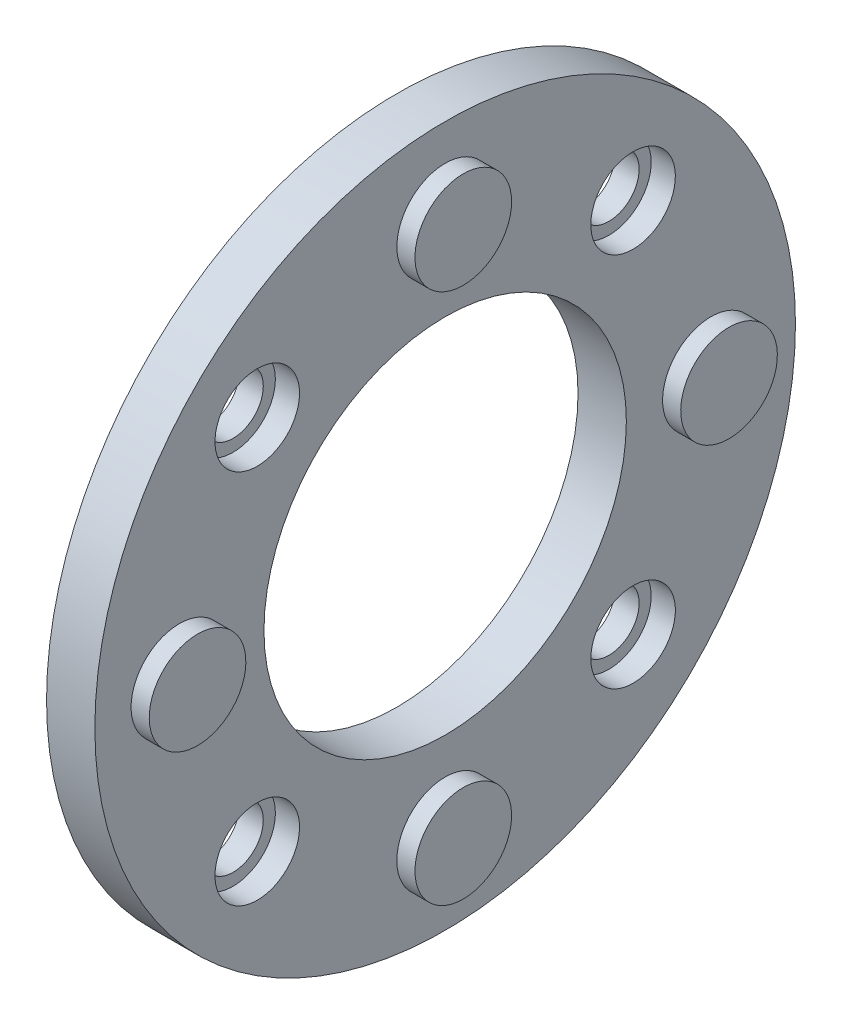
ISO-10303-21;
HEADER;
FILE_DESCRIPTION(('STEP AP214'),'2;1');
FILE_NAME('part.step','',(''),(''),'','','');
FILE_SCHEMA(('AUTOMOTIVE_DESIGN { 1 0 10303 214 1 1 1 1 }'));
ENDSEC;
DATA;
#1=APPLICATION_CONTEXT('core data for automotive mechanical design processes');
#2=APPLICATION_PROTOCOL_DEFINITION('international standard','automotive_design',2000,#1);
#3=PRODUCT_CONTEXT('',#1,'mechanical');
#4=PRODUCT('Part','Part','',(#3));
#5=PRODUCT_RELATED_PRODUCT_CATEGORY('part','',(#4));
#6=PRODUCT_DEFINITION_FORMATION('','',#4);
#7=PRODUCT_DEFINITION_CONTEXT('part definition',#1,'design');
#8=PRODUCT_DEFINITION('design','',#6,#7);
#9=PRODUCT_DEFINITION_SHAPE('','',#8);
#10=(LENGTH_UNIT() NAMED_UNIT(*) SI_UNIT(.MILLI.,.METRE.));
#11=(NAMED_UNIT(*) PLANE_ANGLE_UNIT() SI_UNIT($,.RADIAN.));
#12=(NAMED_UNIT(*) SI_UNIT($,.STERADIAN.) SOLID_ANGLE_UNIT());
#13=UNCERTAINTY_MEASURE_WITH_UNIT(LENGTH_MEASURE(1.E-05),#10,'distance_accuracy_value','');
#14=(GEOMETRIC_REPRESENTATION_CONTEXT(3) GLOBAL_UNCERTAINTY_ASSIGNED_CONTEXT((#13)) GLOBAL_UNIT_ASSIGNED_CONTEXT((#10,
#11,#12)) REPRESENTATION_CONTEXT('',''));
#15=CARTESIAN_POINT('',(0.,0.,0.));
#16=DIRECTION('',(0.,0.,1.));
#17=DIRECTION('',(1.,0.,0.));
#18=AXIS2_PLACEMENT_3D('',#15,#16,#17);
#19=CARTESIAN_POINT('',(-1.,15.556349186104,15.5563491861041));
#20=DIRECTION('',(1.,0.,0.));
#21=DIRECTION('',(0.,0.,-1.));
#22=AXIS2_PLACEMENT_3D('',#19,#20,#21);
#23=CYLINDRICAL_SURFACE('',#22,2.5);
#24=CARTESIAN_POINT('',(0.,15.556349186104,15.5563491861041));
#25=DIRECTION('',(1.,0.,0.));
#26=DIRECTION('',(0.,0.,-1.));
#27=AXIS2_PLACEMENT_3D('',#24,#25,#26);
#28=CIRCLE('',#27,2.5);
#29=CARTESIAN_POINT('',(0.,15.556349186104,13.0563491861041));
#30=VERTEX_POINT('',#29);
#31=EDGE_CURVE('E55',#30,#30,#28,.T.);
#32=ORIENTED_EDGE('',*,*,#31,.F.);
#33=EDGE_LOOP('',(#32));
#34=FACE_BOUND('',#33,.T.);
#35=CARTESIAN_POINT('',(2.,15.556349186104,15.5563491861041));
#36=DIRECTION('',(1.,0.,0.));
#37=DIRECTION('',(0.,0.,-1.));
#38=AXIS2_PLACEMENT_3D('',#35,#36,#37);
#39=CIRCLE('',#38,2.5);
#40=CARTESIAN_POINT('',(2.,15.556349186104,13.0563491861041));
#41=VERTEX_POINT('',#40);
#42=EDGE_CURVE('E43',#41,#41,#39,.F.);
#43=ORIENTED_EDGE('',*,*,#42,.F.);
#44=EDGE_LOOP('',(#43));
#45=FACE_BOUND('',#44,.T.);
#46=ADVANCED_FACE('F39',(#34,#45),#23,.F.);
#47=CARTESIAN_POINT('',(4.,0.,0.));
#48=DIRECTION('',(-1.,0.,0.));
#49=DIRECTION('',(0.,0.,1.));
#50=AXIS2_PLACEMENT_3D('',#47,#48,#49);
#51=CYLINDRICAL_SURFACE('',#50,29.);
#52=CARTESIAN_POINT('',(4.,0.,0.));
#53=DIRECTION('',(1.,0.,0.));
#54=DIRECTION('',(0.,0.,-1.));
#55=AXIS2_PLACEMENT_3D('',#52,#53,#54);
#56=CIRCLE('',#55,29.);
#57=CARTESIAN_POINT('',(4.,0.,-29.));
#58=VERTEX_POINT('',#57);
#59=EDGE_CURVE('E136',#58,#58,#56,.T.);
#60=ORIENTED_EDGE('',*,*,#59,.F.);
#61=EDGE_LOOP('',(#60));
#62=FACE_BOUND('',#61,.T.);
#63=CARTESIAN_POINT('',(0.,0.,0.));
#64=DIRECTION('',(1.,0.,0.));
#65=DIRECTION('',(0.,0.,-1.));
#66=AXIS2_PLACEMENT_3D('',#63,#64,#65);
#67=CIRCLE('',#66,29.);
#68=CARTESIAN_POINT('',(0.,0.,-29.));
#69=VERTEX_POINT('',#68);
#70=EDGE_CURVE('E143',#69,#69,#67,.T.);
#71=ORIENTED_EDGE('',*,*,#70,.T.);
#72=EDGE_LOOP('',(#71));
#73=FACE_BOUND('',#72,.T.);
#74=ADVANCED_FACE('F41',(#62,#73),#51,.T.);
#75=CARTESIAN_POINT('',(4.,0.,0.));
#76=DIRECTION('',(1.,0.,0.));
#77=DIRECTION('',(0.,0.,-1.));
#78=AXIS2_PLACEMENT_3D('',#75,#76,#77);
#79=PLANE('',#78);
#80=CARTESIAN_POINT('',(4.,-15.5563491861042,15.5563491861039));
#81=DIRECTION('',(1.,0.,0.));
#82=DIRECTION('',(0.,1.,0.));
#83=AXIS2_PLACEMENT_3D('',#80,#81,#82);
#84=CIRCLE('',#83,3.5);
#85=CARTESIAN_POINT('',(4.,-12.0563491861042,15.5563491861039));
#86=VERTEX_POINT('',#85);
#87=EDGE_CURVE('E707',#86,#86,#84,.T.);
#88=ORIENTED_EDGE('',*,*,#87,.F.);
#89=EDGE_LOOP('',(#88));
#90=FACE_BOUND('',#89,.T.);
#91=CARTESIAN_POINT('',(4.,-15.556349186104,-15.5563491861041));
#92=DIRECTION('',(1.,0.,0.));
#93=DIRECTION('',(0.,0.,1.));
#94=AXIS2_PLACEMENT_3D('',#91,#92,#93);
#95=CIRCLE('',#94,3.5);
#96=CARTESIAN_POINT('',(4.,-15.556349186104,-12.0563491861041));
#97=VERTEX_POINT('',#96);
#98=EDGE_CURVE('E665',#97,#97,#95,.T.);
#99=ORIENTED_EDGE('',*,*,#98,.F.);
#100=EDGE_LOOP('',(#99));
#101=FACE_BOUND('',#100,.T.);
#102=CARTESIAN_POINT('',(4.,15.5563491861043,-15.5563491861038));
#103=DIRECTION('',(1.,0.,0.));
#104=DIRECTION('',(0.,-1.,0.));
#105=AXIS2_PLACEMENT_3D('',#102,#103,#104);
#106=CIRCLE('',#105,3.5);
#107=CARTESIAN_POINT('',(4.,12.0563491861043,-15.5563491861038));
#108=VERTEX_POINT('',#107);
#109=EDGE_CURVE('E662',#108,#108,#106,.T.);
#110=ORIENTED_EDGE('',*,*,#109,.F.);
#111=EDGE_LOOP('',(#110));
#112=FACE_BOUND('',#111,.T.);
#113=CARTESIAN_POINT('',(4.,15.556349186104,15.5563491861041));
#114=DIRECTION('',(1.,0.,0.));
#115=DIRECTION('',(0.,0.,-1.));
#116=AXIS2_PLACEMENT_3D('',#113,#114,#115);
#117=CIRCLE('',#116,3.5);
#118=CARTESIAN_POINT('',(4.,15.556349186104,12.0563491861041));
#119=VERTEX_POINT('',#118);
#120=EDGE_CURVE('E68',#119,#119,#117,.T.);
#121=ORIENTED_EDGE('',*,*,#120,.F.);
#122=EDGE_LOOP('',(#121));
#123=FACE_BOUND('',#122,.T.);
#124=CARTESIAN_POINT('',(4.,2.30437768363647E-13,-22.));
#125=DIRECTION('',(1.,0.,0.));
#126=DIRECTION('',(0.,0.,-1.));
#127=AXIS2_PLACEMENT_3D('',#124,#125,#126);
#128=CIRCLE('',#127,4.);
#129=CARTESIAN_POINT('',(4.,2.30437768363647E-13,-26.));
#130=VERTEX_POINT('',#129);
#131=EDGE_CURVE('E10',#130,#130,#128,.T.);
#132=ORIENTED_EDGE('',*,*,#131,.F.);
#133=EDGE_LOOP('',(#132));
#134=FACE_BOUND('',#133,.T.);
#135=CARTESIAN_POINT('',(4.,-22.,0.));
#136=DIRECTION('',(1.,0.,0.));
#137=DIRECTION('',(0.,0.,-1.));
#138=AXIS2_PLACEMENT_3D('',#135,#136,#137);
#139=CIRCLE('',#138,4.);
#140=CARTESIAN_POINT('',(4.,-22.,-4.));
#141=VERTEX_POINT('',#140);
#142=EDGE_CURVE('E47',#141,#141,#139,.T.);
#143=ORIENTED_EDGE('',*,*,#142,.F.);
#144=EDGE_LOOP('',(#143));
#145=FACE_BOUND('',#144,.T.);
#146=CARTESIAN_POINT('',(4.,0.,22.));
#147=DIRECTION('',(1.,0.,0.));
#148=DIRECTION('',(0.,0.,-1.));
#149=AXIS2_PLACEMENT_3D('',#146,#147,#148);
#150=CIRCLE('',#149,4.);
#151=CARTESIAN_POINT('',(4.,0.,18.));
#152=VERTEX_POINT('',#151);
#153=EDGE_CURVE('E52',#152,#152,#150,.T.);
#154=ORIENTED_EDGE('',*,*,#153,.F.);
#155=EDGE_LOOP('',(#154));
#156=FACE_BOUND('',#155,.T.);
#157=CARTESIAN_POINT('',(4.,22.,0.));
#158=DIRECTION('',(1.,0.,0.));
#159=DIRECTION('',(0.,0.,-1.));
#160=AXIS2_PLACEMENT_3D('',#157,#158,#159);
#161=CIRCLE('',#160,4.);
#162=CARTESIAN_POINT('',(4.,22.,-4.));
#163=VERTEX_POINT('',#162);
#164=EDGE_CURVE('E133',#163,#163,#161,.T.);
#165=ORIENTED_EDGE('',*,*,#164,.F.);
#166=EDGE_LOOP('',(#165));
#167=FACE_BOUND('',#166,.T.);
#168=CARTESIAN_POINT('',(4.,0.,0.));
#169=DIRECTION('',(1.,0.,0.));
#170=DIRECTION('',(0.,0.,-1.));
#171=AXIS2_PLACEMENT_3D('',#168,#169,#170);
#172=CIRCLE('',#171,15.);
#173=CARTESIAN_POINT('',(4.,0.,-15.));
#174=VERTEX_POINT('',#173);
#175=EDGE_CURVE('E140',#174,#174,#172,.T.);
#176=ORIENTED_EDGE('',*,*,#175,.F.);
#177=EDGE_LOOP('',(#176));
#178=FACE_BOUND('',#177,.T.);
#179=ORIENTED_EDGE('',*,*,#59,.T.);
#180=EDGE_LOOP('',(#179));
#181=FACE_BOUND('',#180,.T.);
#182=ADVANCED_FACE('F155',(#90,#101,#112,#123,#134,#145,#156,#167,#178,#181),#79,.T.);
#183=CARTESIAN_POINT('',(0.,0.,0.));
#184=DIRECTION('',(1.,0.,0.));
#185=DIRECTION('',(0.,0.,-1.));
#186=AXIS2_PLACEMENT_3D('',#183,#184,#185);
#187=PLANE('',#186);
#188=CARTESIAN_POINT('',(0.,-15.5563491861042,15.5563491861039));
#189=DIRECTION('',(1.,0.,0.));
#190=DIRECTION('',(0.,1.,0.));
#191=AXIS2_PLACEMENT_3D('',#188,#189,#190);
#192=CIRCLE('',#191,2.5);
#193=CARTESIAN_POINT('',(0.,-13.0563491861042,15.5563491861039));
#194=VERTEX_POINT('',#193);
#195=EDGE_CURVE('E73',#194,#194,#192,.T.);
#196=ORIENTED_EDGE('',*,*,#195,.T.);
#197=EDGE_LOOP('',(#196));
#198=FACE_BOUND('',#197,.T.);
#199=CARTESIAN_POINT('',(0.,-15.556349186104,-15.5563491861041));
#200=DIRECTION('',(1.,0.,0.));
#201=DIRECTION('',(0.,0.,1.));
#202=AXIS2_PLACEMENT_3D('',#199,#200,#201);
#203=CIRCLE('',#202,2.5);
#204=CARTESIAN_POINT('',(0.,-15.556349186104,-13.0563491861041));
#205=VERTEX_POINT('',#204);
#206=EDGE_CURVE('E681',#205,#205,#203,.T.);
#207=ORIENTED_EDGE('',*,*,#206,.T.);
#208=EDGE_LOOP('',(#207));
#209=FACE_BOUND('',#208,.T.);
#210=CARTESIAN_POINT('',(0.,15.5563491861043,-15.5563491861038));
#211=DIRECTION('',(1.,0.,0.));
#212=DIRECTION('',(0.,-1.,0.));
#213=AXIS2_PLACEMENT_3D('',#210,#211,#212);
#214=CIRCLE('',#213,2.5);
#215=CARTESIAN_POINT('',(0.,13.0563491861043,-15.5563491861038));
#216=VERTEX_POINT('',#215);
#217=EDGE_CURVE('E76',#216,#216,#214,.T.);
#218=ORIENTED_EDGE('',*,*,#217,.T.);
#219=EDGE_LOOP('',(#218));
#220=FACE_BOUND('',#219,.T.);
#221=ORIENTED_EDGE('',*,*,#31,.T.);
#222=EDGE_LOOP('',(#221));
#223=FACE_BOUND('',#222,.T.);
#224=CARTESIAN_POINT('',(0.,2.30437768363647E-13,-22.));
#225=DIRECTION('',(1.,0.,0.));
#226=DIRECTION('',(0.,-1.,0.));
#227=AXIS2_PLACEMENT_3D('',#224,#225,#226);
#228=CIRCLE('',#227,4.);
#229=CARTESIAN_POINT('',(0.,-3.99999999999977,-22.));
#230=VERTEX_POINT('',#229);
#231=EDGE_CURVE('E97',#230,#230,#228,.T.);
#232=ORIENTED_EDGE('',*,*,#231,.T.);
#233=EDGE_LOOP('',(#232));
#234=FACE_BOUND('',#233,.T.);
#235=CARTESIAN_POINT('',(0.,-22.,0.));
#236=DIRECTION('',(1.,0.,0.));
#237=DIRECTION('',(0.,0.,1.));
#238=AXIS2_PLACEMENT_3D('',#235,#236,#237);
#239=CIRCLE('',#238,4.);
#240=CARTESIAN_POINT('',(0.,-22.,4.));
#241=VERTEX_POINT('',#240);
#242=EDGE_CURVE('E105',#241,#241,#239,.T.);
#243=ORIENTED_EDGE('',*,*,#242,.T.);
#244=EDGE_LOOP('',(#243));
#245=FACE_BOUND('',#244,.T.);
#246=CARTESIAN_POINT('',(0.,0.,22.));
#247=DIRECTION('',(1.,0.,0.));
#248=DIRECTION('',(0.,1.,0.));
#249=AXIS2_PLACEMENT_3D('',#246,#247,#248);
#250=CIRCLE('',#249,4.);
#251=CARTESIAN_POINT('',(0.,3.99999999999992,22.));
#252=VERTEX_POINT('',#251);
#253=EDGE_CURVE('E111',#252,#252,#250,.T.);
#254=ORIENTED_EDGE('',*,*,#253,.T.);
#255=EDGE_LOOP('',(#254));
#256=FACE_BOUND('',#255,.T.);
#257=CARTESIAN_POINT('',(0.,22.,0.));
#258=DIRECTION('',(1.,0.,0.));
#259=DIRECTION('',(0.,0.,-1.));
#260=AXIS2_PLACEMENT_3D('',#257,#258,#259);
#261=CIRCLE('',#260,4.);
#262=CARTESIAN_POINT('',(0.,22.,-4.));
#263=VERTEX_POINT('',#262);
#264=EDGE_CURVE('E132',#263,#263,#261,.T.);
#265=ORIENTED_EDGE('',*,*,#264,.T.);
#266=EDGE_LOOP('',(#265));
#267=FACE_BOUND('',#266,.T.);
#268=CARTESIAN_POINT('',(0.,0.,0.));
#269=DIRECTION('',(1.,0.,0.));
#270=DIRECTION('',(0.,0.,-1.));
#271=AXIS2_PLACEMENT_3D('',#268,#269,#270);
#272=CIRCLE('',#271,15.);
#273=CARTESIAN_POINT('',(0.,0.,-15.));
#274=VERTEX_POINT('',#273);
#275=EDGE_CURVE('E137',#274,#274,#272,.T.);
#276=ORIENTED_EDGE('',*,*,#275,.T.);
#277=EDGE_LOOP('',(#276));
#278=FACE_BOUND('',#277,.T.);
#279=ORIENTED_EDGE('',*,*,#70,.F.);
#280=EDGE_LOOP('',(#279));
#281=FACE_BOUND('',#280,.T.);
#282=ADVANCED_FACE('F158',(#198,#209,#220,#223,#234,#245,#256,#267,#278,#281),#187,.F.);
#283=CARTESIAN_POINT('',(0.,0.,0.));
#284=DIRECTION('',(1.,0.,0.));
#285=DIRECTION('',(0.,0.,-1.));
#286=AXIS2_PLACEMENT_3D('',#283,#284,#285);
#287=CYLINDRICAL_SURFACE('',#286,15.);
#288=ORIENTED_EDGE('',*,*,#175,.T.);
#289=EDGE_LOOP('',(#288));
#290=FACE_BOUND('',#289,.T.);
#291=ORIENTED_EDGE('',*,*,#275,.F.);
#292=EDGE_LOOP('',(#291));
#293=FACE_BOUND('',#292,.T.);
#294=ADVANCED_FACE('F172',(#290,#293),#287,.F.);
#295=CARTESIAN_POINT('',(-1.,0.,0.));
#296=DIRECTION('',(1.,0.,0.));
#297=DIRECTION('',(0.,0.,-1.));
#298=AXIS2_PLACEMENT_3D('',#295,#296,#297);
#299=PLANE('',#298);
#300=CARTESIAN_POINT('',(-1.,22.,0.));
#301=DIRECTION('',(-1.,0.,0.));
#302=DIRECTION('',(0.,0.,1.));
#303=AXIS2_PLACEMENT_3D('',#300,#301,#302);
#304=CIRCLE('',#303,2.5);
#305=CARTESIAN_POINT('',(-1.,22.,2.5));
#306=VERTEX_POINT('',#305);
#307=EDGE_CURVE('E86',#306,#306,#304,.T.);
#308=ORIENTED_EDGE('',*,*,#307,.F.);
#309=EDGE_LOOP('',(#308));
#310=FACE_BOUND('',#309,.T.);
#311=CARTESIAN_POINT('',(-1.,22.,0.));
#312=DIRECTION('',(1.,0.,0.));
#313=DIRECTION('',(0.,0.,-1.));
#314=AXIS2_PLACEMENT_3D('',#311,#312,#313);
#315=CIRCLE('',#314,4.);
#316=CARTESIAN_POINT('',(-1.,22.,-4.));
#317=VERTEX_POINT('',#316);
#318=EDGE_CURVE('E129',#317,#317,#315,.T.);
#319=ORIENTED_EDGE('',*,*,#318,.F.);
#320=EDGE_LOOP('',(#319));
#321=FACE_BOUND('',#320,.T.);
#322=ADVANCED_FACE('F177',(#310,#321),#299,.F.);
#323=CARTESIAN_POINT('',(-1.,22.,0.));
#324=DIRECTION('',(1.,0.,0.));
#325=DIRECTION('',(0.,0.,-1.));
#326=AXIS2_PLACEMENT_3D('',#323,#324,#325);
#327=CYLINDRICAL_SURFACE('',#326,4.);
#328=ORIENTED_EDGE('',*,*,#318,.T.);
#329=EDGE_LOOP('',(#328));
#330=FACE_BOUND('',#329,.T.);
#331=ORIENTED_EDGE('',*,*,#264,.F.);
#332=EDGE_LOOP('',(#331));
#333=FACE_BOUND('',#332,.T.);
#334=ADVANCED_FACE('F277',(#330,#333),#327,.T.);
#335=ORIENTED_EDGE('',*,*,#164,.T.);
#336=EDGE_LOOP('',(#335));
#337=FACE_BOUND('',#336,.T.);
#338=CARTESIAN_POINT('',(5.5,22.,0.));
#339=DIRECTION('',(1.,0.,0.));
#340=DIRECTION('',(0.,0.,-1.));
#341=AXIS2_PLACEMENT_3D('',#338,#339,#340);
#342=CIRCLE('',#341,4.);
#343=CARTESIAN_POINT('',(5.5,22.,-4.));
#344=VERTEX_POINT('',#343);
#345=EDGE_CURVE('E126',#344,#344,#342,.T.);
#346=ORIENTED_EDGE('',*,*,#345,.F.);
#347=EDGE_LOOP('',(#346));
#348=FACE_BOUND('',#347,.T.);
#349=ADVANCED_FACE('F273',(#337,#348),#327,.T.);
#350=CARTESIAN_POINT('',(5.5,0.,0.));
#351=DIRECTION('',(1.,0.,0.));
#352=DIRECTION('',(0.,0.,-1.));
#353=AXIS2_PLACEMENT_3D('',#350,#351,#352);
#354=PLANE('',#353);
#355=ORIENTED_EDGE('',*,*,#345,.T.);
#356=EDGE_LOOP('',(#355));
#357=FACE_BOUND('',#356,.T.);
#358=ADVANCED_FACE('F270',(#357),#354,.T.);
#359=CARTESIAN_POINT('',(-1.,0.,22.));
#360=DIRECTION('',(1.,0.,0.));
#361=DIRECTION('',(0.,1.,0.));
#362=AXIS2_PLACEMENT_3D('',#359,#360,#361);
#363=CYLINDRICAL_SURFACE('',#362,4.);
#364=ORIENTED_EDGE('',*,*,#153,.T.);
#365=EDGE_LOOP('',(#364));
#366=FACE_BOUND('',#365,.T.);
#367=CARTESIAN_POINT('',(5.5,0.,22.));
#368=DIRECTION('',(1.,0.,0.));
#369=DIRECTION('',(0.,1.,0.));
#370=AXIS2_PLACEMENT_3D('',#367,#368,#369);
#371=CIRCLE('',#370,4.);
#372=CARTESIAN_POINT('',(5.5,3.99999999999992,22.));
#373=VERTEX_POINT('',#372);
#374=EDGE_CURVE('E123',#373,#373,#371,.T.);
#375=ORIENTED_EDGE('',*,*,#374,.F.);
#376=EDGE_LOOP('',(#375));
#377=FACE_BOUND('',#376,.T.);
#378=ADVANCED_FACE('F152',(#366,#377),#363,.T.);
#379=CARTESIAN_POINT('',(5.5,0.,0.));
#380=DIRECTION('',(1.,0.,0.));
#381=DIRECTION('',(0.,1.,0.));
#382=AXIS2_PLACEMENT_3D('',#379,#380,#381);
#383=PLANE('',#382);
#384=ORIENTED_EDGE('',*,*,#374,.T.);
#385=EDGE_LOOP('',(#384));
#386=FACE_BOUND('',#385,.T.);
#387=ADVANCED_FACE('F263',(#386),#383,.T.);
#388=CARTESIAN_POINT('',(-1.,-22.,0.));
#389=DIRECTION('',(1.,0.,0.));
#390=DIRECTION('',(0.,0.,1.));
#391=AXIS2_PLACEMENT_3D('',#388,#389,#390);
#392=CYLINDRICAL_SURFACE('',#391,4.);
#393=ORIENTED_EDGE('',*,*,#142,.T.);
#394=EDGE_LOOP('',(#393));
#395=FACE_BOUND('',#394,.T.);
#396=CARTESIAN_POINT('',(5.5,-22.,0.));
#397=DIRECTION('',(1.,0.,0.));
#398=DIRECTION('',(0.,0.,1.));
#399=AXIS2_PLACEMENT_3D('',#396,#397,#398);
#400=CIRCLE('',#399,4.);
#401=CARTESIAN_POINT('',(5.5,-22.,4.));
#402=VERTEX_POINT('',#401);
#403=EDGE_CURVE('E120',#402,#402,#400,.T.);
#404=ORIENTED_EDGE('',*,*,#403,.F.);
#405=EDGE_LOOP('',(#404));
#406=FACE_BOUND('',#405,.T.);
#407=ADVANCED_FACE('F259',(#395,#406),#392,.T.);
#408=CARTESIAN_POINT('',(5.5,0.,0.));
#409=DIRECTION('',(1.,0.,0.));
#410=DIRECTION('',(0.,0.,1.));
#411=AXIS2_PLACEMENT_3D('',#408,#409,#410);
#412=PLANE('',#411);
#413=ORIENTED_EDGE('',*,*,#403,.T.);
#414=EDGE_LOOP('',(#413));
#415=FACE_BOUND('',#414,.T.);
#416=ADVANCED_FACE('F256',(#415),#412,.T.);
#417=CARTESIAN_POINT('',(-1.,2.30437768363647E-13,-22.));
#418=DIRECTION('',(1.,0.,0.));
#419=DIRECTION('',(0.,-1.,0.));
#420=AXIS2_PLACEMENT_3D('',#417,#418,#419);
#421=CYLINDRICAL_SURFACE('',#420,4.);
#422=ORIENTED_EDGE('',*,*,#131,.T.);
#423=EDGE_LOOP('',(#422));
#424=FACE_BOUND('',#423,.T.);
#425=CARTESIAN_POINT('',(5.5,2.30437768363647E-13,-22.));
#426=DIRECTION('',(1.,0.,0.));
#427=DIRECTION('',(0.,-1.,0.));
#428=AXIS2_PLACEMENT_3D('',#425,#426,#427);
#429=CIRCLE('',#428,4.);
#430=CARTESIAN_POINT('',(5.5,-3.99999999999977,-22.));
#431=VERTEX_POINT('',#430);
#432=EDGE_CURVE('E117',#431,#431,#429,.T.);
#433=ORIENTED_EDGE('',*,*,#432,.F.);
#434=EDGE_LOOP('',(#433));
#435=FACE_BOUND('',#434,.T.);
#436=ADVANCED_FACE('F252',(#424,#435),#421,.T.);
#437=CARTESIAN_POINT('',(5.5,0.,0.));
#438=DIRECTION('',(1.,0.,0.));
#439=DIRECTION('',(0.,-1.,0.));
#440=AXIS2_PLACEMENT_3D('',#437,#438,#439);
#441=PLANE('',#440);
#442=ORIENTED_EDGE('',*,*,#432,.T.);
#443=EDGE_LOOP('',(#442));
#444=FACE_BOUND('',#443,.T.);
#445=ADVANCED_FACE('F248',(#444),#441,.T.);
#446=CARTESIAN_POINT('',(-1.,0.,0.));
#447=DIRECTION('',(1.,0.,0.));
#448=DIRECTION('',(0.,1.,0.));
#449=AXIS2_PLACEMENT_3D('',#446,#447,#448);
#450=PLANE('',#449);
#451=CARTESIAN_POINT('',(-1.,0.,22.));
#452=DIRECTION('',(-1.,0.,0.));
#453=DIRECTION('',(0.,-1.,0.));
#454=AXIS2_PLACEMENT_3D('',#451,#452,#453);
#455=CIRCLE('',#454,2.5);
#456=CARTESIAN_POINT('',(-1.,-2.50000000000008,22.));
#457=VERTEX_POINT('',#456);
#458=EDGE_CURVE('E79',#457,#457,#455,.T.);
#459=ORIENTED_EDGE('',*,*,#458,.F.);
#460=EDGE_LOOP('',(#459));
#461=FACE_BOUND('',#460,.T.);
#462=CARTESIAN_POINT('',(-1.,0.,22.));
#463=DIRECTION('',(1.,0.,0.));
#464=DIRECTION('',(0.,1.,0.));
#465=AXIS2_PLACEMENT_3D('',#462,#463,#464);
#466=CIRCLE('',#465,4.);
#467=CARTESIAN_POINT('',(-1.,3.99999999999992,22.));
#468=VERTEX_POINT('',#467);
#469=EDGE_CURVE('E114',#468,#468,#466,.T.);
#470=ORIENTED_EDGE('',*,*,#469,.F.);
#471=EDGE_LOOP('',(#470));
#472=FACE_BOUND('',#471,.T.);
#473=ADVANCED_FACE('F244',(#461,#472),#450,.F.);
#474=CARTESIAN_POINT('',(-1.,0.,22.));
#475=DIRECTION('',(1.,0.,0.));
#476=DIRECTION('',(0.,1.,0.));
#477=AXIS2_PLACEMENT_3D('',#474,#475,#476);
#478=CYLINDRICAL_SURFACE('',#477,4.);
#479=ORIENTED_EDGE('',*,*,#469,.T.);
#480=EDGE_LOOP('',(#479));
#481=FACE_BOUND('',#480,.T.);
#482=ORIENTED_EDGE('',*,*,#253,.F.);
#483=EDGE_LOOP('',(#482));
#484=FACE_BOUND('',#483,.T.);
#485=ADVANCED_FACE('F240',(#481,#484),#478,.T.);
#486=CARTESIAN_POINT('',(-1.,0.,0.));
#487=DIRECTION('',(1.,0.,0.));
#488=DIRECTION('',(0.,0.,1.));
#489=AXIS2_PLACEMENT_3D('',#486,#487,#488);
#490=PLANE('',#489);
#491=CARTESIAN_POINT('',(-1.,-22.,0.));
#492=DIRECTION('',(-1.,0.,0.));
#493=DIRECTION('',(0.,0.,-1.));
#494=AXIS2_PLACEMENT_3D('',#491,#492,#493);
#495=CIRCLE('',#494,2.5);
#496=CARTESIAN_POINT('',(-1.,-22.,-2.5));
#497=VERTEX_POINT('',#496);
#498=EDGE_CURVE('E87',#497,#497,#495,.T.);
#499=ORIENTED_EDGE('',*,*,#498,.F.);
#500=EDGE_LOOP('',(#499));
#501=FACE_BOUND('',#500,.T.);
#502=CARTESIAN_POINT('',(-1.,-22.,0.));
#503=DIRECTION('',(1.,0.,0.));
#504=DIRECTION('',(0.,0.,1.));
#505=AXIS2_PLACEMENT_3D('',#502,#503,#504);
#506=CIRCLE('',#505,4.);
#507=CARTESIAN_POINT('',(-1.,-22.,4.));
#508=VERTEX_POINT('',#507);
#509=EDGE_CURVE('E108',#508,#508,#506,.T.);
#510=ORIENTED_EDGE('',*,*,#509,.F.);
#511=EDGE_LOOP('',(#510));
#512=FACE_BOUND('',#511,.T.);
#513=ADVANCED_FACE('F236',(#501,#512),#490,.F.);
#514=CARTESIAN_POINT('',(-1.,-22.,0.));
#515=DIRECTION('',(1.,0.,0.));
#516=DIRECTION('',(0.,0.,1.));
#517=AXIS2_PLACEMENT_3D('',#514,#515,#516);
#518=CYLINDRICAL_SURFACE('',#517,4.);
#519=ORIENTED_EDGE('',*,*,#509,.T.);
#520=EDGE_LOOP('',(#519));
#521=FACE_BOUND('',#520,.T.);
#522=ORIENTED_EDGE('',*,*,#242,.F.);
#523=EDGE_LOOP('',(#522));
#524=FACE_BOUND('',#523,.T.);
#525=ADVANCED_FACE('F232',(#521,#524),#518,.T.);
#526=CARTESIAN_POINT('',(-1.,0.,0.));
#527=DIRECTION('',(1.,0.,0.));
#528=DIRECTION('',(0.,-1.,0.));
#529=AXIS2_PLACEMENT_3D('',#526,#527,#528);
#530=PLANE('',#529);
#531=CARTESIAN_POINT('',(-1.,2.30437768363647E-13,-22.));
#532=DIRECTION('',(-1.,0.,0.));
#533=DIRECTION('',(0.,1.,0.));
#534=AXIS2_PLACEMENT_3D('',#531,#532,#533);
#535=CIRCLE('',#534,2.5);
#536=CARTESIAN_POINT('',(-1.,2.50000000000023,-22.));
#537=VERTEX_POINT('',#536);
#538=EDGE_CURVE('E57',#537,#537,#535,.T.);
#539=ORIENTED_EDGE('',*,*,#538,.F.);
#540=EDGE_LOOP('',(#539));
#541=FACE_BOUND('',#540,.T.);
#542=CARTESIAN_POINT('',(-1.,2.30437768363647E-13,-22.));
#543=DIRECTION('',(1.,0.,0.));
#544=DIRECTION('',(0.,-1.,0.));
#545=AXIS2_PLACEMENT_3D('',#542,#543,#544);
#546=CIRCLE('',#545,4.);
#547=CARTESIAN_POINT('',(-1.,-3.99999999999977,-22.));
#548=VERTEX_POINT('',#547);
#549=EDGE_CURVE('E102',#548,#548,#546,.T.);
#550=ORIENTED_EDGE('',*,*,#549,.F.);
#551=EDGE_LOOP('',(#550));
#552=FACE_BOUND('',#551,.T.);
#553=ADVANCED_FACE('F228',(#541,#552),#530,.F.);
#554=CARTESIAN_POINT('',(-1.,2.30437768363647E-13,-22.));
#555=DIRECTION('',(1.,0.,0.));
#556=DIRECTION('',(0.,-1.,0.));
#557=AXIS2_PLACEMENT_3D('',#554,#555,#556);
#558=CYLINDRICAL_SURFACE('',#557,4.);
#559=ORIENTED_EDGE('',*,*,#549,.T.);
#560=EDGE_LOOP('',(#559));
#561=FACE_BOUND('',#560,.T.);
#562=ORIENTED_EDGE('',*,*,#231,.F.);
#563=EDGE_LOOP('',(#562));
#564=FACE_BOUND('',#563,.T.);
#565=ADVANCED_FACE('F224',(#561,#564),#558,.T.);
#566=CARTESIAN_POINT('',(3.5,22.,0.));
#567=DIRECTION('',(-1.,0.,0.));
#568=DIRECTION('',(0.,0.,1.));
#569=AXIS2_PLACEMENT_3D('',#566,#567,#568);
#570=CYLINDRICAL_SURFACE('',#569,2.5);
#571=CARTESIAN_POINT('',(3.5,22.,0.));
#572=DIRECTION('',(-1.,0.,0.));
#573=DIRECTION('',(0.,0.,1.));
#574=AXIS2_PLACEMENT_3D('',#571,#572,#573);
#575=CIRCLE('',#574,2.5);
#576=CARTESIAN_POINT('',(3.5,22.,2.5));
#577=VERTEX_POINT('',#576);
#578=EDGE_CURVE('E94',#577,#577,#575,.T.);
#579=ORIENTED_EDGE('',*,*,#578,.F.);
#580=EDGE_LOOP('',(#579));
#581=FACE_BOUND('',#580,.T.);
#582=ORIENTED_EDGE('',*,*,#307,.T.);
#583=EDGE_LOOP('',(#582));
#584=FACE_BOUND('',#583,.T.);
#585=ADVANCED_FACE('F220',(#581,#584),#570,.F.);
#586=CARTESIAN_POINT('',(3.5,22.,0.));
#587=DIRECTION('',(-1.,0.,0.));
#588=DIRECTION('',(0.,0.,1.));
#589=AXIS2_PLACEMENT_3D('',#586,#587,#588);
#590=PLANE('',#589);
#591=ORIENTED_EDGE('',*,*,#578,.T.);
#592=EDGE_LOOP('',(#591));
#593=FACE_BOUND('',#592,.T.);
#594=ADVANCED_FACE('F216',(#593),#590,.T.);
#595=CARTESIAN_POINT('',(3.5,2.30437768363647E-13,-22.));
#596=DIRECTION('',(-1.,0.,0.));
#597=DIRECTION('',(0.,1.,0.));
#598=AXIS2_PLACEMENT_3D('',#595,#596,#597);
#599=CYLINDRICAL_SURFACE('',#598,2.5);
#600=CARTESIAN_POINT('',(3.5,2.30437768363647E-13,-22.));
#601=DIRECTION('',(-1.,0.,0.));
#602=DIRECTION('',(0.,1.,0.));
#603=AXIS2_PLACEMENT_3D('',#600,#601,#602);
#604=CIRCLE('',#603,2.5);
#605=CARTESIAN_POINT('',(3.5,2.50000000000023,-22.));
#606=VERTEX_POINT('',#605);
#607=EDGE_CURVE('E61',#606,#606,#604,.T.);
#608=ORIENTED_EDGE('',*,*,#607,.F.);
#609=EDGE_LOOP('',(#608));
#610=FACE_BOUND('',#609,.T.);
#611=ORIENTED_EDGE('',*,*,#538,.T.);
#612=EDGE_LOOP('',(#611));
#613=FACE_BOUND('',#612,.T.);
#614=ADVANCED_FACE('F212',(#610,#613),#599,.F.);
#615=CARTESIAN_POINT('',(3.5,2.30437768363647E-13,-22.));
#616=DIRECTION('',(-1.,0.,0.));
#617=DIRECTION('',(0.,1.,0.));
#618=AXIS2_PLACEMENT_3D('',#615,#616,#617);
#619=PLANE('',#618);
#620=ORIENTED_EDGE('',*,*,#607,.T.);
#621=EDGE_LOOP('',(#620));
#622=FACE_BOUND('',#621,.T.);
#623=ADVANCED_FACE('F208',(#622),#619,.T.);
#624=CARTESIAN_POINT('',(3.5,-22.,0.));
#625=DIRECTION('',(-1.,0.,0.));
#626=DIRECTION('',(0.,0.,-1.));
#627=AXIS2_PLACEMENT_3D('',#624,#625,#626);
#628=CYLINDRICAL_SURFACE('',#627,2.5);
#629=CARTESIAN_POINT('',(3.5,-22.,0.));
#630=DIRECTION('',(-1.,0.,0.));
#631=DIRECTION('',(0.,0.,-1.));
#632=AXIS2_PLACEMENT_3D('',#629,#630,#631);
#633=CIRCLE('',#632,2.5);
#634=CARTESIAN_POINT('',(3.5,-22.,-2.5));
#635=VERTEX_POINT('',#634);
#636=EDGE_CURVE('E83',#635,#635,#633,.T.);
#637=ORIENTED_EDGE('',*,*,#636,.F.);
#638=EDGE_LOOP('',(#637));
#639=FACE_BOUND('',#638,.T.);
#640=ORIENTED_EDGE('',*,*,#498,.T.);
#641=EDGE_LOOP('',(#640));
#642=FACE_BOUND('',#641,.T.);
#643=ADVANCED_FACE('F204',(#639,#642),#628,.F.);
#644=CARTESIAN_POINT('',(3.5,-22.,0.));
#645=DIRECTION('',(-1.,0.,0.));
#646=DIRECTION('',(0.,0.,-1.));
#647=AXIS2_PLACEMENT_3D('',#644,#645,#646);
#648=PLANE('',#647);
#649=ORIENTED_EDGE('',*,*,#636,.T.);
#650=EDGE_LOOP('',(#649));
#651=FACE_BOUND('',#650,.T.);
#652=ADVANCED_FACE('F200',(#651),#648,.T.);
#653=CARTESIAN_POINT('',(3.5,0.,22.));
#654=DIRECTION('',(-1.,0.,0.));
#655=DIRECTION('',(0.,-1.,0.));
#656=AXIS2_PLACEMENT_3D('',#653,#654,#655);
#657=CYLINDRICAL_SURFACE('',#656,2.5);
#658=CARTESIAN_POINT('',(3.5,0.,22.));
#659=DIRECTION('',(-1.,0.,0.));
#660=DIRECTION('',(0.,-1.,0.));
#661=AXIS2_PLACEMENT_3D('',#658,#659,#660);
#662=CIRCLE('',#661,2.5);
#663=CARTESIAN_POINT('',(3.5,-2.50000000000008,22.));
#664=VERTEX_POINT('',#663);
#665=EDGE_CURVE('E82',#664,#664,#662,.T.);
#666=ORIENTED_EDGE('',*,*,#665,.F.);
#667=EDGE_LOOP('',(#666));
#668=FACE_BOUND('',#667,.T.);
#669=ORIENTED_EDGE('',*,*,#458,.T.);
#670=EDGE_LOOP('',(#669));
#671=FACE_BOUND('',#670,.T.);
#672=ADVANCED_FACE('F196',(#668,#671),#657,.F.);
#673=CARTESIAN_POINT('',(3.5,0.,22.));
#674=DIRECTION('',(-1.,0.,0.));
#675=DIRECTION('',(0.,-1.,0.));
#676=AXIS2_PLACEMENT_3D('',#673,#674,#675);
#677=PLANE('',#676);
#678=ORIENTED_EDGE('',*,*,#665,.T.);
#679=EDGE_LOOP('',(#678));
#680=FACE_BOUND('',#679,.T.);
#681=ADVANCED_FACE('F192',(#680),#677,.T.);
#682=CARTESIAN_POINT('',(2.,15.556349186104,15.5563491861041));
#683=DIRECTION('',(1.,0.,0.));
#684=DIRECTION('',(0.,0.,-1.));
#685=AXIS2_PLACEMENT_3D('',#682,#683,#684);
#686=PLANE('',#685);
#687=CARTESIAN_POINT('',(2.,15.556349186104,15.5563491861041));
#688=DIRECTION('',(1.,0.,0.));
#689=DIRECTION('',(0.,0.,-1.));
#690=AXIS2_PLACEMENT_3D('',#687,#688,#689);
#691=CIRCLE('',#690,3.5);
#692=CARTESIAN_POINT('',(2.,15.556349186104,12.0563491861041));
#693=VERTEX_POINT('',#692);
#694=EDGE_CURVE('E64',#693,#693,#691,.T.);
#695=ORIENTED_EDGE('',*,*,#694,.T.);
#696=EDGE_LOOP('',(#695));
#697=FACE_BOUND('',#696,.T.);
#698=ORIENTED_EDGE('',*,*,#42,.T.);
#699=EDGE_LOOP('',(#698));
#700=FACE_BOUND('',#699,.T.);
#701=ADVANCED_FACE('F195',(#697,#700),#686,.T.);
#702=CARTESIAN_POINT('',(2.,15.556349186104,15.5563491861041));
#703=DIRECTION('',(1.,0.,0.));
#704=DIRECTION('',(0.,0.,-1.));
#705=AXIS2_PLACEMENT_3D('',#702,#703,#704);
#706=CYLINDRICAL_SURFACE('',#705,3.5);
#707=ORIENTED_EDGE('',*,*,#694,.F.);
#708=EDGE_LOOP('',(#707));
#709=FACE_BOUND('',#708,.T.);
#710=ORIENTED_EDGE('',*,*,#120,.T.);
#711=EDGE_LOOP('',(#710));
#712=FACE_BOUND('',#711,.T.);
#713=ADVANCED_FACE('F190',(#709,#712),#706,.F.);
#714=CARTESIAN_POINT('',(-1.,15.5563491861043,-15.5563491861038));
#715=DIRECTION('',(1.,0.,0.));
#716=DIRECTION('',(0.,-1.,0.));
#717=AXIS2_PLACEMENT_3D('',#714,#715,#716);
#718=CYLINDRICAL_SURFACE('',#717,2.5);
#719=ORIENTED_EDGE('',*,*,#217,.F.);
#720=EDGE_LOOP('',(#719));
#721=FACE_BOUND('',#720,.T.);
#722=CARTESIAN_POINT('',(2.,15.5563491861043,-15.5563491861038));
#723=DIRECTION('',(1.,0.,0.));
#724=DIRECTION('',(0.,0.,-1.));
#725=AXIS2_PLACEMENT_3D('',#722,#723,#724);
#726=CIRCLE('',#725,2.5);
#727=CARTESIAN_POINT('',(2.,15.5563491861043,-18.0563491861038));
#728=VERTEX_POINT('',#727);
#729=EDGE_CURVE('E678',#728,#728,#726,.F.);
#730=ORIENTED_EDGE('',*,*,#729,.F.);
#731=EDGE_LOOP('',(#730));
#732=FACE_BOUND('',#731,.T.);
#733=ADVANCED_FACE('F337',(#721,#732),#718,.F.);
#734=CARTESIAN_POINT('',(-1.,-15.556349186104,-15.5563491861041));
#735=DIRECTION('',(1.,0.,0.));
#736=DIRECTION('',(0.,0.,1.));
#737=AXIS2_PLACEMENT_3D('',#734,#735,#736);
#738=CYLINDRICAL_SURFACE('',#737,2.5);
#739=ORIENTED_EDGE('',*,*,#206,.F.);
#740=EDGE_LOOP('',(#739));
#741=FACE_BOUND('',#740,.T.);
#742=CARTESIAN_POINT('',(2.,-15.556349186104,-15.5563491861041));
#743=DIRECTION('',(1.,0.,0.));
#744=DIRECTION('',(0.,0.,-1.));
#745=AXIS2_PLACEMENT_3D('',#742,#743,#744);
#746=CIRCLE('',#745,2.5);
#747=CARTESIAN_POINT('',(2.,-15.556349186104,-18.0563491861041));
#748=VERTEX_POINT('',#747);
#749=EDGE_CURVE('E674',#748,#748,#746,.F.);
#750=ORIENTED_EDGE('',*,*,#749,.F.);
#751=EDGE_LOOP('',(#750));
#752=FACE_BOUND('',#751,.T.);
#753=ADVANCED_FACE('F342',(#741,#752),#738,.F.);
#754=CARTESIAN_POINT('',(-1.,-15.5563491861042,15.5563491861039));
#755=DIRECTION('',(1.,0.,0.));
#756=DIRECTION('',(0.,1.,0.));
#757=AXIS2_PLACEMENT_3D('',#754,#755,#756);
#758=CYLINDRICAL_SURFACE('',#757,2.5);
#759=ORIENTED_EDGE('',*,*,#195,.F.);
#760=EDGE_LOOP('',(#759));
#761=FACE_BOUND('',#760,.T.);
#762=CARTESIAN_POINT('',(2.,-15.5563491861042,15.5563491861039));
#763=DIRECTION('',(1.,0.,0.));
#764=DIRECTION('',(0.,0.,-1.));
#765=AXIS2_PLACEMENT_3D('',#762,#763,#764);
#766=CIRCLE('',#765,2.5);
#767=CARTESIAN_POINT('',(2.,-15.5563491861042,13.0563491861039));
#768=VERTEX_POINT('',#767);
#769=EDGE_CURVE('E671',#768,#768,#766,.F.);
#770=ORIENTED_EDGE('',*,*,#769,.F.);
#771=EDGE_LOOP('',(#770));
#772=FACE_BOUND('',#771,.T.);
#773=ADVANCED_FACE('F353',(#761,#772),#758,.F.);
#774=CARTESIAN_POINT('',(2.,-15.5563491861042,15.5563491861039));
#775=DIRECTION('',(1.,0.,0.));
#776=DIRECTION('',(0.,1.,0.));
#777=AXIS2_PLACEMENT_3D('',#774,#775,#776);
#778=PLANE('',#777);
#779=CARTESIAN_POINT('',(2.,-15.5563491861042,15.5563491861039));
#780=DIRECTION('',(1.,0.,0.));
#781=DIRECTION('',(0.,1.,0.));
#782=AXIS2_PLACEMENT_3D('',#779,#780,#781);
#783=CIRCLE('',#782,3.5);
#784=CARTESIAN_POINT('',(2.,-12.0563491861042,15.5563491861039));
#785=VERTEX_POINT('',#784);
#786=EDGE_CURVE('E675',#785,#785,#783,.T.);
#787=ORIENTED_EDGE('',*,*,#786,.T.);
#788=EDGE_LOOP('',(#787));
#789=FACE_BOUND('',#788,.T.);
#790=ORIENTED_EDGE('',*,*,#769,.T.);
#791=EDGE_LOOP('',(#790));
#792=FACE_BOUND('',#791,.T.);
#793=ADVANCED_FACE('F364',(#789,#792),#778,.T.);
#794=CARTESIAN_POINT('',(2.,-15.5563491861042,15.5563491861039));
#795=DIRECTION('',(1.,0.,0.));
#796=DIRECTION('',(0.,1.,0.));
#797=AXIS2_PLACEMENT_3D('',#794,#795,#796);
#798=CYLINDRICAL_SURFACE('',#797,3.5);
#799=ORIENTED_EDGE('',*,*,#786,.F.);
#800=EDGE_LOOP('',(#799));
#801=FACE_BOUND('',#800,.T.);
#802=ORIENTED_EDGE('',*,*,#87,.T.);
#803=EDGE_LOOP('',(#802));
#804=FACE_BOUND('',#803,.T.);
#805=ADVANCED_FACE('F375',(#801,#804),#798,.F.);
#806=CARTESIAN_POINT('',(2.,-15.556349186104,-15.5563491861041));
#807=DIRECTION('',(1.,0.,0.));
#808=DIRECTION('',(0.,0.,1.));
#809=AXIS2_PLACEMENT_3D('',#806,#807,#808);
#810=PLANE('',#809);
#811=CARTESIAN_POINT('',(2.,-15.556349186104,-15.5563491861041));
#812=DIRECTION('',(1.,0.,0.));
#813=DIRECTION('',(0.,0.,1.));
#814=AXIS2_PLACEMENT_3D('',#811,#812,#813);
#815=CIRCLE('',#814,3.5);
#816=CARTESIAN_POINT('',(2.,-15.556349186104,-12.0563491861041));
#817=VERTEX_POINT('',#816);
#818=EDGE_CURVE('E668',#817,#817,#815,.T.);
#819=ORIENTED_EDGE('',*,*,#818,.T.);
#820=EDGE_LOOP('',(#819));
#821=FACE_BOUND('',#820,.T.);
#822=ORIENTED_EDGE('',*,*,#749,.T.);
#823=EDGE_LOOP('',(#822));
#824=FACE_BOUND('',#823,.T.);
#825=ADVANCED_FACE('F386',(#821,#824),#810,.T.);
#826=CARTESIAN_POINT('',(2.,-15.556349186104,-15.5563491861041));
#827=DIRECTION('',(1.,0.,0.));
#828=DIRECTION('',(0.,0.,1.));
#829=AXIS2_PLACEMENT_3D('',#826,#827,#828);
#830=CYLINDRICAL_SURFACE('',#829,3.5);
#831=ORIENTED_EDGE('',*,*,#818,.F.);
#832=EDGE_LOOP('',(#831));
#833=FACE_BOUND('',#832,.T.);
#834=ORIENTED_EDGE('',*,*,#98,.T.);
#835=EDGE_LOOP('',(#834));
#836=FACE_BOUND('',#835,.T.);
#837=ADVANCED_FACE('F397',(#833,#836),#830,.F.);
#838=CARTESIAN_POINT('',(2.,15.5563491861043,-15.5563491861038));
#839=DIRECTION('',(1.,0.,0.));
#840=DIRECTION('',(0.,-1.,0.));
#841=AXIS2_PLACEMENT_3D('',#838,#839,#840);
#842=PLANE('',#841);
#843=CARTESIAN_POINT('',(2.,15.5563491861043,-15.5563491861038));
#844=DIRECTION('',(1.,0.,0.));
#845=DIRECTION('',(0.,-1.,0.));
#846=AXIS2_PLACEMENT_3D('',#843,#844,#845);
#847=CIRCLE('',#846,3.5);
#848=CARTESIAN_POINT('',(2.,12.0563491861043,-15.5563491861038));
#849=VERTEX_POINT('',#848);
#850=EDGE_CURVE('E659',#849,#849,#847,.T.);
#851=ORIENTED_EDGE('',*,*,#850,.T.);
#852=EDGE_LOOP('',(#851));
#853=FACE_BOUND('',#852,.T.);
#854=ORIENTED_EDGE('',*,*,#729,.T.);
#855=EDGE_LOOP('',(#854));
#856=FACE_BOUND('',#855,.T.);
#857=ADVANCED_FACE('F408',(#853,#856),#842,.T.);
#858=CARTESIAN_POINT('',(2.,15.5563491861043,-15.5563491861038));
#859=DIRECTION('',(1.,0.,0.));
#860=DIRECTION('',(0.,-1.,0.));
#861=AXIS2_PLACEMENT_3D('',#858,#859,#860);
#862=CYLINDRICAL_SURFACE('',#861,3.5);
#863=ORIENTED_EDGE('',*,*,#850,.F.);
#864=EDGE_LOOP('',(#863));
#865=FACE_BOUND('',#864,.T.);
#866=ORIENTED_EDGE('',*,*,#109,.T.);
#867=EDGE_LOOP('',(#866));
#868=FACE_BOUND('',#867,.T.);
#869=ADVANCED_FACE('F419',(#865,#868),#862,.F.);
#870=CLOSED_SHELL('',(#46,#74,#182,#282,#294,#322,#334,#349,#358,#378,#387,#407,#416,#436,#445,
#473,#485,#513,#525,#553,#565,#585,#594,#614,#623,#643,#652,#672,#681,#701,#713,#733,#753,#773,
#793,#805,#825,#837,#857,#869));
#871=MANIFOLD_SOLID_BREP('B2',#870);
#872=ADVANCED_BREP_SHAPE_REPRESENTATION('',(#18,#871),#14);
#873=SHAPE_DEFINITION_REPRESENTATION(#9,#872);
ENDSEC;
END-ISO-10303-21;
